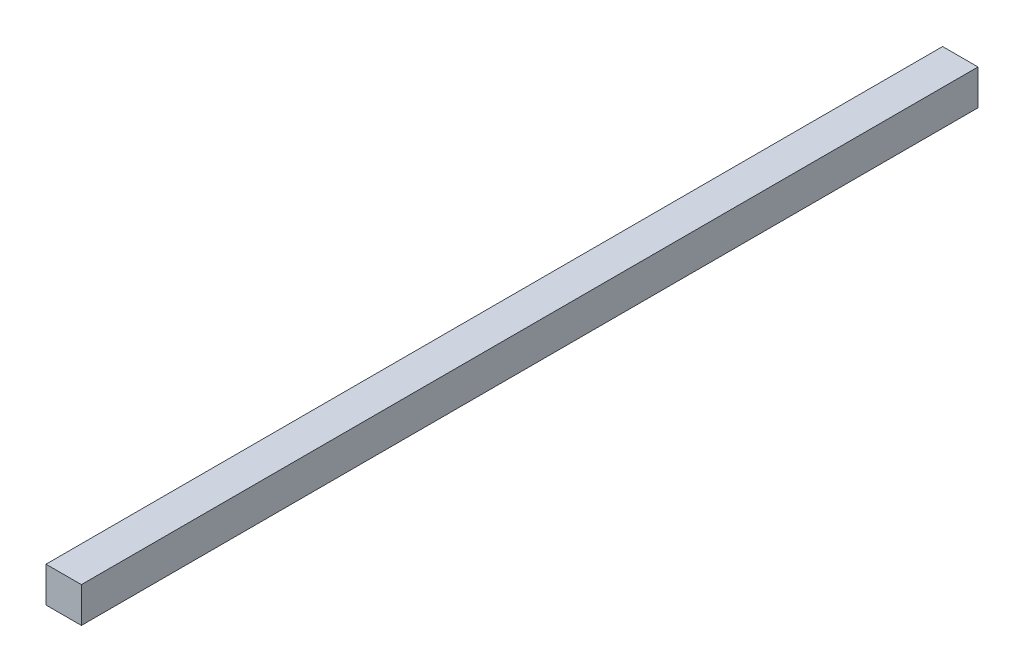
ISO-10303-21;
HEADER;
FILE_DESCRIPTION(('STEP AP214'),'2;1');
FILE_NAME('part.step','',(''),(''),'','','');
FILE_SCHEMA(('AUTOMOTIVE_DESIGN { 1 0 10303 214 1 1 1 1 }'));
ENDSEC;
DATA;
#1=APPLICATION_CONTEXT('core data for automotive mechanical design processes');
#2=APPLICATION_PROTOCOL_DEFINITION('international standard','automotive_design',2000,#1);
#3=PRODUCT_CONTEXT('',#1,'mechanical');
#4=PRODUCT('Part','Part','',(#3));
#5=PRODUCT_RELATED_PRODUCT_CATEGORY('part','',(#4));
#6=PRODUCT_DEFINITION_FORMATION('','',#4);
#7=PRODUCT_DEFINITION_CONTEXT('part definition',#1,'design');
#8=PRODUCT_DEFINITION('design','',#6,#7);
#9=PRODUCT_DEFINITION_SHAPE('','',#8);
#10=(LENGTH_UNIT() NAMED_UNIT(*) SI_UNIT(.MILLI.,.METRE.));
#11=(NAMED_UNIT(*) PLANE_ANGLE_UNIT() SI_UNIT($,.RADIAN.));
#12=(NAMED_UNIT(*) SI_UNIT($,.STERADIAN.) SOLID_ANGLE_UNIT());
#13=UNCERTAINTY_MEASURE_WITH_UNIT(LENGTH_MEASURE(1.E-05),#10,'distance_accuracy_value','');
#14=(GEOMETRIC_REPRESENTATION_CONTEXT(3) GLOBAL_UNCERTAINTY_ASSIGNED_CONTEXT((#13)) GLOBAL_UNIT_ASSIGNED_CONTEXT((#10,
#11,#12)) REPRESENTATION_CONTEXT('',''));
#15=CARTESIAN_POINT('',(0.,0.,0.));
#16=DIRECTION('',(0.,0.,1.));
#17=DIRECTION('',(1.,0.,0.));
#18=AXIS2_PLACEMENT_3D('',#15,#16,#17);
#19=CARTESIAN_POINT('',(18.,0.,0.));
#20=DIRECTION('',(0.,0.,-1.));
#21=DIRECTION('',(-1.,0.,0.));
#22=AXIS2_PLACEMENT_3D('',#19,#20,#21);
#23=PLANE('',#22);
#24=DIRECTION('',(0.,-1.,0.));
#25=VECTOR('',#24,1.);
#26=CARTESIAN_POINT('',(0.,0.,0.));
#27=LINE('',#26,#25);
#28=CARTESIAN_POINT('',(0.,18.,0.));
#29=VERTEX_POINT('',#28);
#30=CARTESIAN_POINT('',(0.,0.,0.));
#31=VERTEX_POINT('',#30);
#32=EDGE_CURVE('E96',#29,#31,#27,.T.);
#33=ORIENTED_EDGE('',*,*,#32,.T.);
#34=DIRECTION('',(-1.,0.,0.));
#35=VECTOR('',#34,1.);
#36=CARTESIAN_POINT('',(18.,0.,0.));
#37=LINE('',#36,#35);
#38=CARTESIAN_POINT('',(18.,0.,0.));
#39=VERTEX_POINT('',#38);
#40=EDGE_CURVE('E11',#39,#31,#37,.T.);
#41=ORIENTED_EDGE('',*,*,#40,.F.);
#42=DIRECTION('',(0.,-1.,0.));
#43=VECTOR('',#42,1.);
#44=CARTESIAN_POINT('',(18.,0.,0.));
#45=LINE('',#44,#43);
#46=CARTESIAN_POINT('',(18.,18.,0.));
#47=VERTEX_POINT('',#46);
#48=EDGE_CURVE('E84',#47,#39,#45,.T.);
#49=ORIENTED_EDGE('',*,*,#48,.F.);
#50=DIRECTION('',(-1.,0.,0.));
#51=VECTOR('',#50,1.);
#52=CARTESIAN_POINT('',(18.,18.,0.));
#53=LINE('',#52,#51);
#54=EDGE_CURVE('E92',#47,#29,#53,.T.);
#55=ORIENTED_EDGE('',*,*,#54,.T.);
#56=EDGE_LOOP('',(#33,#41,#49,#55));
#57=FACE_BOUND('',#56,.T.);
#58=ADVANCED_FACE('F33',(#57),#23,.F.);
#59=CARTESIAN_POINT('',(18.,0.,0.));
#60=DIRECTION('',(0.,1.,0.));
#61=DIRECTION('',(0.,0.,1.));
#62=AXIS2_PLACEMENT_3D('',#59,#60,#61);
#63=PLANE('',#62);
#64=DIRECTION('',(0.,0.,-1.));
#65=VECTOR('',#64,1.);
#66=CARTESIAN_POINT('',(0.,0.,0.));
#67=LINE('',#66,#65);
#68=CARTESIAN_POINT('',(0.,0.,-456.));
#69=VERTEX_POINT('',#68);
#70=EDGE_CURVE('E88',#31,#69,#67,.T.);
#71=ORIENTED_EDGE('',*,*,#70,.T.);
#72=DIRECTION('',(-1.,0.,0.));
#73=VECTOR('',#72,1.);
#74=CARTESIAN_POINT('',(18.,0.,-456.));
#75=LINE('',#74,#73);
#76=CARTESIAN_POINT('',(18.,0.,-456.));
#77=VERTEX_POINT('',#76);
#78=EDGE_CURVE('E41',#77,#69,#75,.T.);
#79=ORIENTED_EDGE('',*,*,#78,.F.);
#80=DIRECTION('',(0.,0.,-1.));
#81=VECTOR('',#80,1.);
#82=CARTESIAN_POINT('',(18.,0.,0.));
#83=LINE('',#82,#81);
#84=EDGE_CURVE('E79',#39,#77,#83,.T.);
#85=ORIENTED_EDGE('',*,*,#84,.F.);
#86=ORIENTED_EDGE('',*,*,#40,.T.);
#87=EDGE_LOOP('',(#71,#79,#85,#86));
#88=FACE_BOUND('',#87,.T.);
#89=ADVANCED_FACE('F87',(#88),#63,.F.);
#90=CARTESIAN_POINT('',(18.,0.,-456.));
#91=DIRECTION('',(0.,0.,1.));
#92=DIRECTION('',(1.,0.,0.));
#93=AXIS2_PLACEMENT_3D('',#90,#91,#92);
#94=PLANE('',#93);
#95=DIRECTION('',(0.,1.,0.));
#96=VECTOR('',#95,1.);
#97=CARTESIAN_POINT('',(0.,0.,-456.));
#98=LINE('',#97,#96);
#99=CARTESIAN_POINT('',(0.,18.,-456.));
#100=VERTEX_POINT('',#99);
#101=EDGE_CURVE('E66',#69,#100,#98,.T.);
#102=ORIENTED_EDGE('',*,*,#101,.T.);
#103=DIRECTION('',(-1.,0.,0.));
#104=VECTOR('',#103,1.);
#105=CARTESIAN_POINT('',(18.,18.,-456.));
#106=LINE('',#105,#104);
#107=CARTESIAN_POINT('',(18.,18.,-456.));
#108=VERTEX_POINT('',#107);
#109=EDGE_CURVE('E89',#108,#100,#106,.T.);
#110=ORIENTED_EDGE('',*,*,#109,.F.);
#111=DIRECTION('',(0.,1.,0.));
#112=VECTOR('',#111,1.);
#113=CARTESIAN_POINT('',(18.,0.,-456.));
#114=LINE('',#113,#112);
#115=EDGE_CURVE('E82',#77,#108,#114,.T.);
#116=ORIENTED_EDGE('',*,*,#115,.F.);
#117=ORIENTED_EDGE('',*,*,#78,.T.);
#118=EDGE_LOOP('',(#102,#110,#116,#117));
#119=FACE_BOUND('',#118,.T.);
#120=ADVANCED_FACE('F90',(#119),#94,.F.);
#121=CARTESIAN_POINT('',(18.,18.,0.));
#122=DIRECTION('',(0.,-1.,0.));
#123=DIRECTION('',(0.,0.,-1.));
#124=AXIS2_PLACEMENT_3D('',#121,#122,#123);
#125=PLANE('',#124);
#126=DIRECTION('',(0.,0.,1.));
#127=VECTOR('',#126,1.);
#128=CARTESIAN_POINT('',(0.,18.,0.));
#129=LINE('',#128,#127);
#130=EDGE_CURVE('E72',#100,#29,#129,.T.);
#131=ORIENTED_EDGE('',*,*,#130,.T.);
#132=ORIENTED_EDGE('',*,*,#54,.F.);
#133=DIRECTION('',(0.,0.,1.));
#134=VECTOR('',#133,1.);
#135=CARTESIAN_POINT('',(18.,18.,0.));
#136=LINE('',#135,#134);
#137=EDGE_CURVE('E49',#108,#47,#136,.T.);
#138=ORIENTED_EDGE('',*,*,#137,.F.);
#139=ORIENTED_EDGE('',*,*,#109,.T.);
#140=EDGE_LOOP('',(#131,#132,#138,#139));
#141=FACE_BOUND('',#140,.T.);
#142=ADVANCED_FACE('F103',(#141),#125,.F.);
#143=CARTESIAN_POINT('',(18.,0.,0.));
#144=DIRECTION('',(-1.,0.,0.));
#145=DIRECTION('',(0.,0.,1.));
#146=AXIS2_PLACEMENT_3D('',#143,#144,#145);
#147=PLANE('',#146);
#148=ORIENTED_EDGE('',*,*,#48,.T.);
#149=ORIENTED_EDGE('',*,*,#84,.T.);
#150=ORIENTED_EDGE('',*,*,#115,.T.);
#151=ORIENTED_EDGE('',*,*,#137,.T.);
#152=EDGE_LOOP('',(#148,#149,#150,#151));
#153=FACE_BOUND('',#152,.T.);
#154=ADVANCED_FACE('F80',(#153),#147,.F.);
#155=CARTESIAN_POINT('',(0.,0.,0.));
#156=DIRECTION('',(-1.,0.,0.));
#157=DIRECTION('',(0.,0.,1.));
#158=AXIS2_PLACEMENT_3D('',#155,#156,#157);
#159=PLANE('',#158);
#160=ORIENTED_EDGE('',*,*,#32,.F.);
#161=ORIENTED_EDGE('',*,*,#130,.F.);
#162=ORIENTED_EDGE('',*,*,#101,.F.);
#163=ORIENTED_EDGE('',*,*,#70,.F.);
#164=EDGE_LOOP('',(#160,#161,#162,#163));
#165=FACE_BOUND('',#164,.T.);
#166=ADVANCED_FACE('F106',(#165),#159,.T.);
#167=CLOSED_SHELL('',(#58,#89,#120,#142,#154,#166));
#168=MANIFOLD_SOLID_BREP('B2',#167);
#169=ADVANCED_BREP_SHAPE_REPRESENTATION('',(#18,#168),#14);
#170=SHAPE_DEFINITION_REPRESENTATION(#9,#169);
ENDSEC;
END-ISO-10303-21;
